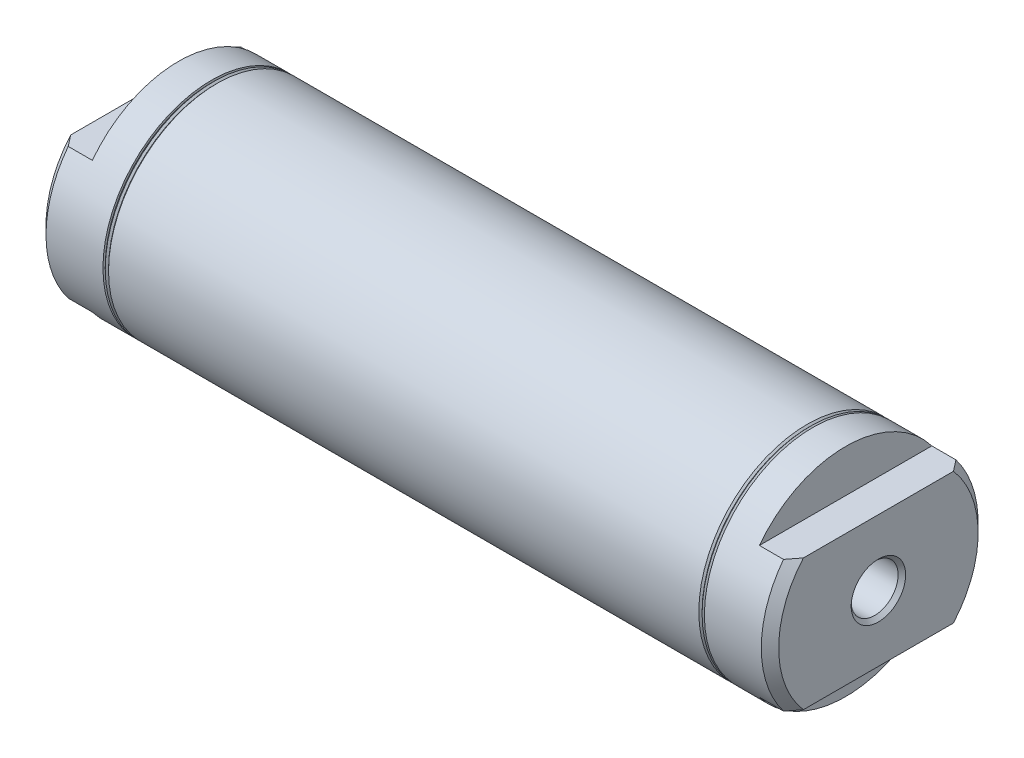
ISO-10303-21;
HEADER;
FILE_DESCRIPTION(('STEP AP214'),'2;1');
FILE_NAME('part.step','',(''),(''),'','','');
FILE_SCHEMA(('AUTOMOTIVE_DESIGN { 1 0 10303 214 1 1 1 1 }'));
ENDSEC;
DATA;
#1=APPLICATION_CONTEXT('core data for automotive mechanical design processes');
#2=APPLICATION_PROTOCOL_DEFINITION('international standard','automotive_design',2000,#1);
#3=PRODUCT_CONTEXT('',#1,'mechanical');
#4=PRODUCT('Part','Part','',(#3));
#5=PRODUCT_RELATED_PRODUCT_CATEGORY('part','',(#4));
#6=PRODUCT_DEFINITION_FORMATION('','',#4);
#7=PRODUCT_DEFINITION_CONTEXT('part definition',#1,'design');
#8=PRODUCT_DEFINITION('design','',#6,#7);
#9=PRODUCT_DEFINITION_SHAPE('','',#8);
#10=(LENGTH_UNIT() NAMED_UNIT(*) SI_UNIT(.MILLI.,.METRE.));
#11=(NAMED_UNIT(*) PLANE_ANGLE_UNIT() SI_UNIT($,.RADIAN.));
#12=(NAMED_UNIT(*) SI_UNIT($,.STERADIAN.) SOLID_ANGLE_UNIT());
#13=UNCERTAINTY_MEASURE_WITH_UNIT(LENGTH_MEASURE(1.E-05),#10,'distance_accuracy_value','');
#14=(GEOMETRIC_REPRESENTATION_CONTEXT(3) GLOBAL_UNCERTAINTY_ASSIGNED_CONTEXT((#13)) GLOBAL_UNIT_ASSIGNED_CONTEXT((#10,
#11,#12)) REPRESENTATION_CONTEXT('',''));
#15=CARTESIAN_POINT('',(0.,0.,0.));
#16=DIRECTION('',(0.,0.,1.));
#17=DIRECTION('',(1.,0.,0.));
#18=AXIS2_PLACEMENT_3D('',#15,#16,#17);
#19=CARTESIAN_POINT('',(176.9872,0.,0.));
#20=DIRECTION('',(-1.,0.,0.));
#21=DIRECTION('',(0.,0.,1.));
#22=AXIS2_PLACEMENT_3D('',#19,#20,#21);
#23=CYLINDRICAL_SURFACE('',#22,26.1874);
#24=DIRECTION('',(1.,0.,0.));
#25=VECTOR('',#24,1.);
#26=CARTESIAN_POINT('',(169.0624,15.875,-20.8270087569003));
#27=LINE('',#26,#25);
#28=CARTESIAN_POINT('',(169.0624,15.875,-20.8270087569003));
#29=VERTEX_POINT('',#28);
#30=CARTESIAN_POINT('',(174.892208,15.875,-20.8270087569003));
#31=VERTEX_POINT('',#30);
#32=EDGE_CURVE('E157',#29,#31,#27,.T.);
#33=ORIENTED_EDGE('',*,*,#32,.T.);
#34=CARTESIAN_POINT('',(174.892208,0.,0.));
#35=DIRECTION('',(1.,0.,0.));
#36=DIRECTION('',(0.,0.,-1.));
#37=AXIS2_PLACEMENT_3D('',#34,#35,#36);
#38=CIRCLE('',#37,26.1874);
#39=CARTESIAN_POINT('',(174.892208,-15.875,-20.8270087569003));
#40=VERTEX_POINT('',#39);
#41=EDGE_CURVE('E144',#31,#40,#38,.F.);
#42=ORIENTED_EDGE('',*,*,#41,.T.);
#43=DIRECTION('',(1.,0.,0.));
#44=VECTOR('',#43,1.);
#45=CARTESIAN_POINT('',(169.0624,-15.875,-20.8270087569003));
#46=LINE('',#45,#44);
#47=CARTESIAN_POINT('',(169.0624,-15.875,-20.8270087569003));
#48=VERTEX_POINT('',#47);
#49=EDGE_CURVE('E137',#48,#40,#46,.T.);
#50=ORIENTED_EDGE('',*,*,#49,.F.);
#51=CARTESIAN_POINT('',(169.0624,0.,0.));
#52=DIRECTION('',(1.,0.,0.));
#53=DIRECTION('',(0.,0.,-1.));
#54=AXIS2_PLACEMENT_3D('',#51,#52,#53);
#55=CIRCLE('',#54,26.1874);
#56=CARTESIAN_POINT('',(169.0624,-15.875,20.8270087569003));
#57=VERTEX_POINT('',#56);
#58=EDGE_CURVE('E125',#57,#48,#55,.T.);
#59=ORIENTED_EDGE('',*,*,#58,.F.);
#60=DIRECTION('',(1.,0.,0.));
#61=VECTOR('',#60,1.);
#62=CARTESIAN_POINT('',(169.0624,-15.875,20.8270087569003));
#63=LINE('',#62,#61);
#64=CARTESIAN_POINT('',(174.892208,-15.875,20.8270087569003));
#65=VERTEX_POINT('',#64);
#66=EDGE_CURVE('E138',#57,#65,#63,.T.);
#67=ORIENTED_EDGE('',*,*,#66,.T.);
#68=CARTESIAN_POINT('',(174.892208,0.,0.));
#69=DIRECTION('',(1.,0.,0.));
#70=DIRECTION('',(0.,0.,-1.));
#71=AXIS2_PLACEMENT_3D('',#68,#69,#70);
#72=CIRCLE('',#71,26.1874);
#73=CARTESIAN_POINT('',(174.892208,15.875,20.8270087569003));
#74=VERTEX_POINT('',#73);
#75=EDGE_CURVE('E309',#65,#74,#72,.F.);
#76=ORIENTED_EDGE('',*,*,#75,.T.);
#77=DIRECTION('',(1.,0.,0.));
#78=VECTOR('',#77,1.);
#79=CARTESIAN_POINT('',(169.0624,15.875,20.8270087569003));
#80=LINE('',#79,#78);
#81=CARTESIAN_POINT('',(169.0624,15.875,20.8270087569003));
#82=VERTEX_POINT('',#81);
#83=EDGE_CURVE('E155',#82,#74,#80,.T.);
#84=ORIENTED_EDGE('',*,*,#83,.F.);
#85=CARTESIAN_POINT('',(169.0624,0.,0.));
#86=DIRECTION('',(1.,0.,0.));
#87=DIRECTION('',(0.,0.,-1.));
#88=AXIS2_PLACEMENT_3D('',#85,#86,#87);
#89=CIRCLE('',#88,26.1874);
#90=EDGE_CURVE('E150',#29,#82,#89,.T.);
#91=ORIENTED_EDGE('',*,*,#90,.F.);
#92=EDGE_LOOP('',(#33,#42,#50,#59,#67,#76,#84,#91));
#93=FACE_BOUND('',#92,.T.);
#94=CARTESIAN_POINT('',(161.1376,0.,0.));
#95=DIRECTION('',(-1.,0.,0.));
#96=DIRECTION('',(0.,0.,1.));
#97=AXIS2_PLACEMENT_3D('',#94,#95,#96);
#98=CIRCLE('',#97,26.1874);
#99=CARTESIAN_POINT('',(161.1376,0.,26.1874));
#100=VERTEX_POINT('',#99);
#101=EDGE_CURVE('E184',#100,#100,#98,.T.);
#102=ORIENTED_EDGE('',*,*,#101,.F.);
#103=EDGE_LOOP('',(#102));
#104=FACE_BOUND('',#103,.T.);
#105=ADVANCED_FACE('F35',(#93,#104),#23,.T.);
#106=CARTESIAN_POINT('',(176.9872,26.1874,0.));
#107=DIRECTION('',(1.,0.,0.));
#108=DIRECTION('',(0.,0.,-1.));
#109=AXIS2_PLACEMENT_3D('',#106,#107,#108);
#110=PLANE('',#109);
#111=CARTESIAN_POINT('',(176.9872,0.,0.));
#112=DIRECTION('',(1.,0.,0.));
#113=DIRECTION('',(0.,0.,-1.));
#114=AXIS2_PLACEMENT_3D('',#111,#112,#113);
#115=CIRCLE('',#114,6.57849999999999);
#116=CARTESIAN_POINT('',(176.9872,0.,-6.57849999999997));
#117=VERTEX_POINT('',#116);
#118=EDGE_CURVE('E618',#117,#117,#115,.F.);
#119=ORIENTED_EDGE('',*,*,#118,.T.);
#120=EDGE_LOOP('',(#119));
#121=FACE_BOUND('',#120,.T.);
#122=DIRECTION('',(0.,0.,1.));
#123=VECTOR('',#122,1.);
#124=CARTESIAN_POINT('',(176.9872,-15.875,-20.8270087569003));
#125=LINE('',#124,#123);
#126=CARTESIAN_POINT('',(176.9872,-15.875,-18.122596343749));
#127=VERTEX_POINT('',#126);
#128=CARTESIAN_POINT('',(176.9872,-15.875,18.122596343749));
#129=VERTEX_POINT('',#128);
#130=EDGE_CURVE('E132',#127,#129,#125,.T.);
#131=ORIENTED_EDGE('',*,*,#130,.F.);
#132=CARTESIAN_POINT('',(176.9872,0.,0.));
#133=DIRECTION('',(1.,0.,0.));
#134=DIRECTION('',(0.,0.,-1.));
#135=AXIS2_PLACEMENT_3D('',#132,#133,#134);
#136=CIRCLE('',#135,24.092408);
#137=CARTESIAN_POINT('',(176.9872,15.875,-18.122596343749));
#138=VERTEX_POINT('',#137);
#139=EDGE_CURVE('E50',#127,#138,#136,.T.);
#140=ORIENTED_EDGE('',*,*,#139,.T.);
#141=DIRECTION('',(0.,0.,-1.));
#142=VECTOR('',#141,1.);
#143=CARTESIAN_POINT('',(176.9872,15.875,20.8270087569003));
#144=LINE('',#143,#142);
#145=CARTESIAN_POINT('',(176.9872,15.875,18.122596343749));
#146=VERTEX_POINT('',#145);
#147=EDGE_CURVE('E146',#146,#138,#144,.T.);
#148=ORIENTED_EDGE('',*,*,#147,.F.);
#149=CARTESIAN_POINT('',(176.9872,0.,0.));
#150=DIRECTION('',(1.,0.,0.));
#151=DIRECTION('',(0.,0.,-1.));
#152=AXIS2_PLACEMENT_3D('',#149,#150,#151);
#153=CIRCLE('',#152,24.092408);
#154=EDGE_CURVE('E361',#146,#129,#153,.T.);
#155=ORIENTED_EDGE('',*,*,#154,.T.);
#156=EDGE_LOOP('',(#131,#140,#148,#155));
#157=FACE_BOUND('',#156,.T.);
#158=ADVANCED_FACE('F290',(#121,#157),#110,.T.);
#159=CARTESIAN_POINT('',(0.,0.,0.));
#160=DIRECTION('',(-1.,0.,0.));
#161=DIRECTION('',(0.,0.,1.));
#162=AXIS2_PLACEMENT_3D('',#159,#160,#161);
#163=PLANE('',#162);
#164=CARTESIAN_POINT('',(0.,0.,0.));
#165=DIRECTION('',(-1.,0.,0.));
#166=DIRECTION('',(0.,0.,1.));
#167=AXIS2_PLACEMENT_3D('',#164,#165,#166);
#168=CIRCLE('',#167,6.57850000000002);
#169=CARTESIAN_POINT('',(0.,0.,6.57850000000002));
#170=VERTEX_POINT('',#169);
#171=EDGE_CURVE('E11',#170,#170,#168,.F.);
#172=ORIENTED_EDGE('',*,*,#171,.T.);
#173=EDGE_LOOP('',(#172));
#174=FACE_BOUND('',#173,.T.);
#175=DIRECTION('',(0.,0.,-1.));
#176=VECTOR('',#175,1.);
#177=CARTESIAN_POINT('',(0.,-15.875,20.8270087569003));
#178=LINE('',#177,#176);
#179=CARTESIAN_POINT('',(0.,-15.875,18.122596343749));
#180=VERTEX_POINT('',#179);
#181=CARTESIAN_POINT('',(0.,-15.875,-18.122596343749));
#182=VERTEX_POINT('',#181);
#183=EDGE_CURVE('E159',#180,#182,#178,.T.);
#184=ORIENTED_EDGE('',*,*,#183,.F.);
#185=CARTESIAN_POINT('',(0.,0.,0.));
#186=DIRECTION('',(-1.,0.,0.));
#187=DIRECTION('',(0.,0.,1.));
#188=AXIS2_PLACEMENT_3D('',#185,#186,#187);
#189=CIRCLE('',#188,24.092408);
#190=CARTESIAN_POINT('',(0.,15.875,18.122596343749));
#191=VERTEX_POINT('',#190);
#192=EDGE_CURVE('E219',#180,#191,#189,.T.);
#193=ORIENTED_EDGE('',*,*,#192,.T.);
#194=DIRECTION('',(0.,0.,1.));
#195=VECTOR('',#194,1.);
#196=CARTESIAN_POINT('',(0.,15.875,-20.8270087569003));
#197=LINE('',#196,#195);
#198=CARTESIAN_POINT('',(0.,15.875,-18.122596343749));
#199=VERTEX_POINT('',#198);
#200=EDGE_CURVE('E171',#199,#191,#197,.T.);
#201=ORIENTED_EDGE('',*,*,#200,.F.);
#202=CARTESIAN_POINT('',(0.,0.,0.));
#203=DIRECTION('',(-1.,0.,0.));
#204=DIRECTION('',(0.,0.,1.));
#205=AXIS2_PLACEMENT_3D('',#202,#203,#204);
#206=CIRCLE('',#205,24.092408);
#207=EDGE_CURVE('E216',#199,#182,#206,.T.);
#208=ORIENTED_EDGE('',*,*,#207,.T.);
#209=EDGE_LOOP('',(#184,#193,#201,#208));
#210=FACE_BOUND('',#209,.T.);
#211=ADVANCED_FACE('F286',(#174,#210),#163,.T.);
#212=CARTESIAN_POINT('',(176.9872,0.,0.));
#213=DIRECTION('',(-1.,0.,0.));
#214=DIRECTION('',(0.,0.,1.));
#215=AXIS2_PLACEMENT_3D('',#212,#213,#214);
#216=CYLINDRICAL_SURFACE('',#215,26.1874);
#217=DIRECTION('',(-1.,0.,0.));
#218=VECTOR('',#217,1.);
#219=CARTESIAN_POINT('',(7.9248,15.875,20.8270087569003));
#220=LINE('',#219,#218);
#221=CARTESIAN_POINT('',(7.92480000000001,15.875,20.8270087569003));
#222=VERTEX_POINT('',#221);
#223=CARTESIAN_POINT('',(2.09499200000002,15.875,20.8270087569003));
#224=VERTEX_POINT('',#223);
#225=EDGE_CURVE('E181',#222,#224,#220,.T.);
#226=ORIENTED_EDGE('',*,*,#225,.T.);
#227=CARTESIAN_POINT('',(2.09499200000002,0.,0.));
#228=DIRECTION('',(-1.,0.,0.));
#229=DIRECTION('',(0.,0.,1.));
#230=AXIS2_PLACEMENT_3D('',#227,#228,#229);
#231=CIRCLE('',#230,26.1874);
#232=CARTESIAN_POINT('',(2.09499200000002,-15.875,20.8270087569003));
#233=VERTEX_POINT('',#232);
#234=EDGE_CURVE('E560',#224,#233,#231,.F.);
#235=ORIENTED_EDGE('',*,*,#234,.T.);
#236=DIRECTION('',(-1.,0.,0.));
#237=VECTOR('',#236,1.);
#238=CARTESIAN_POINT('',(7.9248,-15.875,20.8270087569003));
#239=LINE('',#238,#237);
#240=CARTESIAN_POINT('',(7.9248,-15.875,20.8270087569003));
#241=VERTEX_POINT('',#240);
#242=EDGE_CURVE('E165',#241,#233,#239,.T.);
#243=ORIENTED_EDGE('',*,*,#242,.F.);
#244=CARTESIAN_POINT('',(7.9248,0.,0.));
#245=DIRECTION('',(-1.,0.,0.));
#246=DIRECTION('',(0.,0.,1.));
#247=AXIS2_PLACEMENT_3D('',#244,#245,#246);
#248=CIRCLE('',#247,26.1874);
#249=CARTESIAN_POINT('',(7.92480000000001,-15.875,-20.8270087569003));
#250=VERTEX_POINT('',#249);
#251=EDGE_CURVE('E161',#250,#241,#248,.T.);
#252=ORIENTED_EDGE('',*,*,#251,.F.);
#253=DIRECTION('',(-1.,0.,0.));
#254=VECTOR('',#253,1.);
#255=CARTESIAN_POINT('',(7.9248,-15.875,-20.8270087569003));
#256=LINE('',#255,#254);
#257=CARTESIAN_POINT('',(2.09499200000002,-15.875,-20.8270087569003));
#258=VERTEX_POINT('',#257);
#259=EDGE_CURVE('E168',#250,#258,#256,.T.);
#260=ORIENTED_EDGE('',*,*,#259,.T.);
#261=CARTESIAN_POINT('',(2.09499200000002,0.,0.));
#262=DIRECTION('',(-1.,0.,0.));
#263=DIRECTION('',(0.,0.,1.));
#264=AXIS2_PLACEMENT_3D('',#261,#262,#263);
#265=CIRCLE('',#264,26.1874);
#266=CARTESIAN_POINT('',(2.09499200000002,15.875,-20.8270087569003));
#267=VERTEX_POINT('',#266);
#268=EDGE_CURVE('E556',#258,#267,#265,.F.);
#269=ORIENTED_EDGE('',*,*,#268,.T.);
#270=DIRECTION('',(-1.,0.,0.));
#271=VECTOR('',#270,1.);
#272=CARTESIAN_POINT('',(7.9248,15.875,-20.8270087569003));
#273=LINE('',#272,#271);
#274=CARTESIAN_POINT('',(7.9248,15.875,-20.8270087569003));
#275=VERTEX_POINT('',#274);
#276=EDGE_CURVE('E178',#275,#267,#273,.T.);
#277=ORIENTED_EDGE('',*,*,#276,.F.);
#278=CARTESIAN_POINT('',(7.9248,0.,0.));
#279=DIRECTION('',(-1.,0.,0.));
#280=DIRECTION('',(0.,0.,1.));
#281=AXIS2_PLACEMENT_3D('',#278,#279,#280);
#282=CIRCLE('',#281,26.1874);
#283=EDGE_CURVE('E174',#222,#275,#282,.T.);
#284=ORIENTED_EDGE('',*,*,#283,.F.);
#285=EDGE_LOOP('',(#226,#235,#243,#252,#260,#269,#277,#284));
#286=FACE_BOUND('',#285,.T.);
#287=CARTESIAN_POINT('',(15.8496,0.,0.));
#288=DIRECTION('',(-1.,0.,0.));
#289=DIRECTION('',(0.,0.,1.));
#290=AXIS2_PLACEMENT_3D('',#287,#288,#289);
#291=CIRCLE('',#290,26.1874);
#292=CARTESIAN_POINT('',(15.8496,0.,26.1874));
#293=VERTEX_POINT('',#292);
#294=EDGE_CURVE('E213',#293,#293,#291,.T.);
#295=ORIENTED_EDGE('',*,*,#294,.T.);
#296=EDGE_LOOP('',(#295));
#297=FACE_BOUND('',#296,.T.);
#298=ADVANCED_FACE('F282',(#286,#297),#216,.T.);
#299=CARTESIAN_POINT('',(15.8496,26.1874,0.));
#300=DIRECTION('',(1.,0.,0.));
#301=DIRECTION('',(0.,0.,-1.));
#302=AXIS2_PLACEMENT_3D('',#299,#300,#301);
#303=PLANE('',#302);
#304=CARTESIAN_POINT('',(15.8496,0.,0.));
#305=DIRECTION('',(-1.,0.,0.));
#306=DIRECTION('',(0.,0.,1.));
#307=AXIS2_PLACEMENT_3D('',#304,#305,#306);
#308=CIRCLE('',#307,25.632664);
#309=CARTESIAN_POINT('',(15.8496,0.,25.632664));
#310=VERTEX_POINT('',#309);
#311=EDGE_CURVE('E210',#310,#310,#308,.T.);
#312=ORIENTED_EDGE('',*,*,#311,.T.);
#313=EDGE_LOOP('',(#312));
#314=FACE_BOUND('',#313,.T.);
#315=ORIENTED_EDGE('',*,*,#294,.F.);
#316=EDGE_LOOP('',(#315));
#317=FACE_BOUND('',#316,.T.);
#318=ADVANCED_FACE('F278',(#314,#317),#303,.T.);
#319=CARTESIAN_POINT('',(15.8496,0.,0.));
#320=DIRECTION('',(1.,0.,0.));
#321=DIRECTION('',(0.,0.,-1.));
#322=AXIS2_PLACEMENT_3D('',#319,#320,#321);
#323=CONICAL_SURFACE('',#322,25.632664,0.785398163397448);
#324=CARTESIAN_POINT('',(16.404336,0.,0.));
#325=DIRECTION('',(-1.,0.,0.));
#326=DIRECTION('',(0.,0.,1.));
#327=AXIS2_PLACEMENT_3D('',#324,#325,#326);
#328=CIRCLE('',#327,26.1874);
#329=CARTESIAN_POINT('',(16.404336,0.,26.1874));
#330=VERTEX_POINT('',#329);
#331=EDGE_CURVE('E207',#330,#330,#328,.T.);
#332=ORIENTED_EDGE('',*,*,#331,.T.);
#333=EDGE_LOOP('',(#332));
#334=FACE_BOUND('',#333,.T.);
#335=ORIENTED_EDGE('',*,*,#311,.F.);
#336=EDGE_LOOP('',(#335));
#337=FACE_BOUND('',#336,.T.);
#338=ADVANCED_FACE('F274',(#334,#337),#323,.T.);
#339=CARTESIAN_POINT('',(16.404336,0.,0.));
#340=DIRECTION('',(-1.,0.,0.));
#341=DIRECTION('',(0.,0.,1.));
#342=AXIS2_PLACEMENT_3D('',#339,#340,#341);
#343=CONICAL_SURFACE('',#342,26.1874,0.785398163397475);
#344=CARTESIAN_POINT('',(16.800576,0.,0.));
#345=DIRECTION('',(-1.,0.,0.));
#346=DIRECTION('',(0.,0.,1.));
#347=AXIS2_PLACEMENT_3D('',#344,#345,#346);
#348=CIRCLE('',#347,25.79116);
#349=CARTESIAN_POINT('',(16.800576,0.,25.79116));
#350=VERTEX_POINT('',#349);
#351=EDGE_CURVE('E204',#350,#350,#348,.T.);
#352=ORIENTED_EDGE('',*,*,#351,.T.);
#353=EDGE_LOOP('',(#352));
#354=FACE_BOUND('',#353,.T.);
#355=ORIENTED_EDGE('',*,*,#331,.F.);
#356=EDGE_LOOP('',(#355));
#357=FACE_BOUND('',#356,.T.);
#358=ADVANCED_FACE('F270',(#354,#357),#343,.T.);
#359=CARTESIAN_POINT('',(16.800576,0.,0.));
#360=DIRECTION('',(1.,0.,0.));
#361=DIRECTION('',(0.,0.,-1.));
#362=AXIS2_PLACEMENT_3D('',#359,#360,#361);
#363=CONICAL_SURFACE('',#362,25.79116,0.785398163397461);
#364=CARTESIAN_POINT('',(17.196816,0.,0.));
#365=DIRECTION('',(-1.,0.,0.));
#366=DIRECTION('',(0.,0.,1.));
#367=AXIS2_PLACEMENT_3D('',#364,#365,#366);
#368=CIRCLE('',#367,26.1874);
#369=CARTESIAN_POINT('',(17.196816,0.,26.1874));
#370=VERTEX_POINT('',#369);
#371=EDGE_CURVE('E201',#370,#370,#368,.T.);
#372=ORIENTED_EDGE('',*,*,#371,.T.);
#373=EDGE_LOOP('',(#372));
#374=FACE_BOUND('',#373,.T.);
#375=ORIENTED_EDGE('',*,*,#351,.F.);
#376=EDGE_LOOP('',(#375));
#377=FACE_BOUND('',#376,.T.);
#378=ADVANCED_FACE('F266',(#374,#377),#363,.T.);
#379=CARTESIAN_POINT('',(176.9872,0.,0.));
#380=DIRECTION('',(-1.,0.,0.));
#381=DIRECTION('',(0.,0.,1.));
#382=AXIS2_PLACEMENT_3D('',#379,#380,#381);
#383=CYLINDRICAL_SURFACE('',#382,26.1874);
#384=CARTESIAN_POINT('',(159.790384,0.,0.));
#385=DIRECTION('',(-1.,0.,0.));
#386=DIRECTION('',(0.,0.,1.));
#387=AXIS2_PLACEMENT_3D('',#384,#385,#386);
#388=CIRCLE('',#387,26.1874);
#389=CARTESIAN_POINT('',(159.790384,0.,26.1874));
#390=VERTEX_POINT('',#389);
#391=EDGE_CURVE('E198',#390,#390,#388,.T.);
#392=ORIENTED_EDGE('',*,*,#391,.T.);
#393=EDGE_LOOP('',(#392));
#394=FACE_BOUND('',#393,.T.);
#395=ORIENTED_EDGE('',*,*,#371,.F.);
#396=EDGE_LOOP('',(#395));
#397=FACE_BOUND('',#396,.T.);
#398=ADVANCED_FACE('F262',(#394,#397),#383,.T.);
#399=CARTESIAN_POINT('',(159.790384,0.,0.));
#400=DIRECTION('',(-1.,0.,0.));
#401=DIRECTION('',(0.,0.,1.));
#402=AXIS2_PLACEMENT_3D('',#399,#400,#401);
#403=CONICAL_SURFACE('',#402,26.1874,0.785398163397439);
#404=CARTESIAN_POINT('',(160.186624,0.,0.));
#405=DIRECTION('',(-1.,0.,0.));
#406=DIRECTION('',(0.,0.,1.));
#407=AXIS2_PLACEMENT_3D('',#404,#405,#406);
#408=CIRCLE('',#407,25.79116);
#409=CARTESIAN_POINT('',(160.186624,0.,25.79116));
#410=VERTEX_POINT('',#409);
#411=EDGE_CURVE('E195',#410,#410,#408,.T.);
#412=ORIENTED_EDGE('',*,*,#411,.T.);
#413=EDGE_LOOP('',(#412));
#414=FACE_BOUND('',#413,.T.);
#415=ORIENTED_EDGE('',*,*,#391,.F.);
#416=EDGE_LOOP('',(#415));
#417=FACE_BOUND('',#416,.T.);
#418=ADVANCED_FACE('F258',(#414,#417),#403,.T.);
#419=CARTESIAN_POINT('',(160.186624,0.,0.));
#420=DIRECTION('',(1.,0.,0.));
#421=DIRECTION('',(0.,0.,-1.));
#422=AXIS2_PLACEMENT_3D('',#419,#420,#421);
#423=CONICAL_SURFACE('',#422,25.79116,0.785398163397396);
#424=CARTESIAN_POINT('',(160.582864,0.,0.));
#425=DIRECTION('',(-1.,0.,0.));
#426=DIRECTION('',(0.,0.,1.));
#427=AXIS2_PLACEMENT_3D('',#424,#425,#426);
#428=CIRCLE('',#427,26.1874);
#429=CARTESIAN_POINT('',(160.582864,0.,26.1874));
#430=VERTEX_POINT('',#429);
#431=EDGE_CURVE('E192',#430,#430,#428,.T.);
#432=ORIENTED_EDGE('',*,*,#431,.T.);
#433=EDGE_LOOP('',(#432));
#434=FACE_BOUND('',#433,.T.);
#435=ORIENTED_EDGE('',*,*,#411,.F.);
#436=EDGE_LOOP('',(#435));
#437=FACE_BOUND('',#436,.T.);
#438=ADVANCED_FACE('F254',(#434,#437),#423,.T.);
#439=CARTESIAN_POINT('',(160.582864,0.,0.));
#440=DIRECTION('',(-1.,0.,0.));
#441=DIRECTION('',(0.,0.,1.));
#442=AXIS2_PLACEMENT_3D('',#439,#440,#441);
#443=CONICAL_SURFACE('',#442,26.1874,0.785398163397436);
#444=CARTESIAN_POINT('',(161.1376,0.,0.));
#445=DIRECTION('',(-1.,0.,0.));
#446=DIRECTION('',(0.,0.,1.));
#447=AXIS2_PLACEMENT_3D('',#444,#445,#446);
#448=CIRCLE('',#447,25.632664);
#449=CARTESIAN_POINT('',(161.1376,0.,25.632664));
#450=VERTEX_POINT('',#449);
#451=EDGE_CURVE('E189',#450,#450,#448,.T.);
#452=ORIENTED_EDGE('',*,*,#451,.T.);
#453=EDGE_LOOP('',(#452));
#454=FACE_BOUND('',#453,.T.);
#455=ORIENTED_EDGE('',*,*,#431,.F.);
#456=EDGE_LOOP('',(#455));
#457=FACE_BOUND('',#456,.T.);
#458=ADVANCED_FACE('F250',(#454,#457),#443,.T.);
#459=CARTESIAN_POINT('',(161.1376,25.632664,0.));
#460=DIRECTION('',(-1.,0.,0.));
#461=DIRECTION('',(0.,0.,1.));
#462=AXIS2_PLACEMENT_3D('',#459,#460,#461);
#463=PLANE('',#462);
#464=ORIENTED_EDGE('',*,*,#101,.T.);
#465=EDGE_LOOP('',(#464));
#466=FACE_BOUND('',#465,.T.);
#467=ORIENTED_EDGE('',*,*,#451,.F.);
#468=EDGE_LOOP('',(#467));
#469=FACE_BOUND('',#468,.T.);
#470=ADVANCED_FACE('F244',(#466,#469),#463,.T.);
#471=CARTESIAN_POINT('',(7.9248,15.875,-20.8270087569003));
#472=DIRECTION('',(0.,-1.,0.));
#473=DIRECTION('',(0.,0.,-1.));
#474=AXIS2_PLACEMENT_3D('',#471,#472,#473);
#475=PLANE('',#474);
#476=ORIENTED_EDGE('',*,*,#200,.T.);
#477=CARTESIAN_POINT('',(0.,15.875,18.122596343749));
#478=CARTESIAN_POINT('',(0.171381692511651,15.875,18.3504285411159));
#479=CARTESIAN_POINT('',(0.343654117806424,15.875,18.5775891206213));
#480=CARTESIAN_POINT('',(0.689835989970988,15.875,19.0306434375234));
#481=CARTESIAN_POINT('',(0.863745362446376,15.875,19.2565372317542));
#482=CARTESIAN_POINT('',(1.21307124662204,15.875,19.7071537192967));
#483=CARTESIAN_POINT('',(1.38848774998017,15.875,19.9318764190794));
#484=CARTESIAN_POINT('',(1.7407207726971,15.875,20.3802385432839));
#485=CARTESIAN_POINT('',(1.91753735500781,15.875,20.6038779182589));
#486=CARTESIAN_POINT('',(2.09499199999998,15.875,20.8270087569003));
#487=B_SPLINE_CURVE_WITH_KNOTS('',3,(#477,#478,#479,#480,#481,#482,#483,#484,#485,#486),
.UNSPECIFIED.,.F.,.F.,(4,2,2,2,4),(0.,0.855281182686254,1.71052368126857,2.5657614490328,
3.42103789181922),.UNSPECIFIED.);
#488=EDGE_CURVE('E229',#191,#224,#487,.T.);
#489=ORIENTED_EDGE('',*,*,#488,.T.);
#490=ORIENTED_EDGE('',*,*,#225,.F.);
#491=DIRECTION('',(0.,0.,1.));
#492=VECTOR('',#491,1.);
#493=CARTESIAN_POINT('',(7.9248,15.875,-20.8270087569003));
#494=LINE('',#493,#492);
#495=EDGE_CURVE('E176',#275,#222,#494,.T.);
#496=ORIENTED_EDGE('',*,*,#495,.F.);
#497=ORIENTED_EDGE('',*,*,#276,.T.);
#498=CARTESIAN_POINT('',(2.09499200000002,15.875,-20.8270087569003));
#499=CARTESIAN_POINT('',(1.91753735500782,15.875,-20.6038779182589));
#500=CARTESIAN_POINT('',(1.7407207726971,15.875,-20.3802385432839));
#501=CARTESIAN_POINT('',(1.38848774998017,15.875,-19.9318764190794));
#502=CARTESIAN_POINT('',(1.21307124662204,15.875,-19.7071537192967));
#503=CARTESIAN_POINT('',(0.863745362446378,15.875,-19.2565372317542));
#504=CARTESIAN_POINT('',(0.689835989970988,15.875,-19.0306434375234));
#505=CARTESIAN_POINT('',(0.343654117806422,15.875,-18.5775891206213));
#506=CARTESIAN_POINT('',(0.17138169251165,15.875,-18.3504285411159));
#507=CARTESIAN_POINT('',(0.,15.875,-18.122596343749));
#508=B_SPLINE_CURVE_WITH_KNOTS('',3,(#498,#499,#500,#501,#502,#503,#504,#505,#506,#507),
.UNSPECIFIED.,.F.,.F.,(4,2,2,2,4),(0.,0.855276442786417,1.71051421055065,2.56575670913298,
3.42103789181923),.UNSPECIFIED.);
#509=EDGE_CURVE('E222',#267,#199,#508,.T.);
#510=ORIENTED_EDGE('',*,*,#509,.T.);
#511=EDGE_LOOP('',(#476,#489,#490,#496,#497,#510));
#512=FACE_BOUND('',#511,.T.);
#513=ADVANCED_FACE('F238',(#512),#475,.F.);
#514=CARTESIAN_POINT('',(7.9248,0.,0.));
#515=DIRECTION('',(-1.,0.,0.));
#516=DIRECTION('',(0.,0.,1.));
#517=AXIS2_PLACEMENT_3D('',#514,#515,#516);
#518=PLANE('',#517);
#519=ORIENTED_EDGE('',*,*,#283,.T.);
#520=ORIENTED_EDGE('',*,*,#495,.T.);
#521=EDGE_LOOP('',(#519,#520));
#522=FACE_BOUND('',#521,.T.);
#523=ADVANCED_FACE('F243',(#522),#518,.T.);
#524=CARTESIAN_POINT('',(7.9248,-15.875,20.8270087569003));
#525=DIRECTION('',(0.,1.,0.));
#526=DIRECTION('',(0.,0.,1.));
#527=AXIS2_PLACEMENT_3D('',#524,#525,#526);
#528=PLANE('',#527);
#529=ORIENTED_EDGE('',*,*,#242,.T.);
#530=CARTESIAN_POINT('',(2.09499200000002,-15.875,20.8270087569003));
#531=CARTESIAN_POINT('',(1.91753735500782,-15.875,20.6038779182589));
#532=CARTESIAN_POINT('',(1.7407207726971,-15.875,20.3802385432839));
#533=CARTESIAN_POINT('',(1.38848774998017,-15.875,19.9318764190794));
#534=CARTESIAN_POINT('',(1.21307124662204,-15.875,19.7071537192967));
#535=CARTESIAN_POINT('',(0.863745362446378,-15.875,19.2565372317542));
#536=CARTESIAN_POINT('',(0.689835989970988,-15.875,19.0306434375234));
#537=CARTESIAN_POINT('',(0.343654117806422,-15.875,18.5775891206213));
#538=CARTESIAN_POINT('',(0.17138169251165,-15.875,18.3504285411159));
#539=CARTESIAN_POINT('',(0.,-15.875,18.122596343749));
#540=B_SPLINE_CURVE_WITH_KNOTS('',3,(#530,#531,#532,#533,#534,#535,#536,#537,#538,#539),
.UNSPECIFIED.,.F.,.F.,(4,2,2,2,4),(0.,0.855276442786417,1.71051421055065,2.56575670913298,
3.42103789181923),.UNSPECIFIED.);
#541=EDGE_CURVE('E303',#233,#180,#540,.T.);
#542=ORIENTED_EDGE('',*,*,#541,.T.);
#543=ORIENTED_EDGE('',*,*,#183,.T.);
#544=CARTESIAN_POINT('',(0.,-15.875,-18.122596343749));
#545=CARTESIAN_POINT('',(0.171381692511651,-15.875,-18.3504285411159));
#546=CARTESIAN_POINT('',(0.343654117806424,-15.875,-18.5775891206213));
#547=CARTESIAN_POINT('',(0.689835989970988,-15.875,-19.0306434375234));
#548=CARTESIAN_POINT('',(0.863745362446376,-15.875,-19.2565372317542));
#549=CARTESIAN_POINT('',(1.21307124662204,-15.875,-19.7071537192967));
#550=CARTESIAN_POINT('',(1.38848774998017,-15.875,-19.9318764190794));
#551=CARTESIAN_POINT('',(1.7407207726971,-15.875,-20.3802385432839));
#552=CARTESIAN_POINT('',(1.91753735500781,-15.875,-20.6038779182589));
#553=CARTESIAN_POINT('',(2.09499199999998,-15.875,-20.8270087569003));
#554=B_SPLINE_CURVE_WITH_KNOTS('',3,(#544,#545,#546,#547,#548,#549,#550,#551,#552,#553),
.UNSPECIFIED.,.F.,.F.,(4,2,2,2,4),(0.,0.855281182686254,1.71052368126857,2.5657614490328,
3.42103789181922),.UNSPECIFIED.);
#555=EDGE_CURVE('E310',#182,#258,#554,.T.);
#556=ORIENTED_EDGE('',*,*,#555,.T.);
#557=ORIENTED_EDGE('',*,*,#259,.F.);
#558=DIRECTION('',(0.,0.,-1.));
#559=VECTOR('',#558,1.);
#560=CARTESIAN_POINT('',(7.9248,-15.875,20.8270087569003));
#561=LINE('',#560,#559);
#562=EDGE_CURVE('E163',#241,#250,#561,.T.);
#563=ORIENTED_EDGE('',*,*,#562,.F.);
#564=EDGE_LOOP('',(#529,#542,#543,#556,#557,#563));
#565=FACE_BOUND('',#564,.T.);
#566=ADVANCED_FACE('F316',(#565),#528,.F.);
#567=CARTESIAN_POINT('',(7.9248,0.,0.));
#568=DIRECTION('',(-1.,0.,0.));
#569=DIRECTION('',(0.,0.,1.));
#570=AXIS2_PLACEMENT_3D('',#567,#568,#569);
#571=PLANE('',#570);
#572=ORIENTED_EDGE('',*,*,#251,.T.);
#573=ORIENTED_EDGE('',*,*,#562,.T.);
#574=EDGE_LOOP('',(#572,#573));
#575=FACE_BOUND('',#574,.T.);
#576=ADVANCED_FACE('F320',(#575),#571,.T.);
#577=CARTESIAN_POINT('',(169.0624,15.875,20.8270087569003));
#578=DIRECTION('',(0.,-1.,0.));
#579=DIRECTION('',(0.,0.,-1.));
#580=AXIS2_PLACEMENT_3D('',#577,#578,#579);
#581=PLANE('',#580);
#582=ORIENTED_EDGE('',*,*,#147,.T.);
#583=CARTESIAN_POINT('',(176.9872,15.875,-18.122596343749));
#584=CARTESIAN_POINT('',(176.815818307488,15.875,-18.3504285411158));
#585=CARTESIAN_POINT('',(176.643545882194,15.875,-18.5775891206213));
#586=CARTESIAN_POINT('',(176.297364010029,15.875,-19.0306434375234));
#587=CARTESIAN_POINT('',(176.123454637554,15.875,-19.2565372317542));
#588=CARTESIAN_POINT('',(175.774128753378,15.875,-19.7071537192967));
#589=CARTESIAN_POINT('',(175.59871225002,15.875,-19.9318764190794));
#590=CARTESIAN_POINT('',(175.246479227303,15.875,-20.3802385432839));
#591=CARTESIAN_POINT('',(175.069662644992,15.875,-20.6038779182589));
#592=CARTESIAN_POINT('',(174.892208,15.875,-20.8270087569003));
#593=B_SPLINE_CURVE_WITH_KNOTS('',3,(#583,#584,#585,#586,#587,#588,#589,#590,#591,#592),
.UNSPECIFIED.,.F.,.F.,(4,2,2,2,4),(0.,0.855281182686237,1.71052368126856,2.56576144903281,
3.42103789181924),.UNSPECIFIED.);
#594=EDGE_CURVE('E340',#138,#31,#593,.T.);
#595=ORIENTED_EDGE('',*,*,#594,.T.);
#596=ORIENTED_EDGE('',*,*,#32,.F.);
#597=DIRECTION('',(0.,0.,-1.));
#598=VECTOR('',#597,1.);
#599=CARTESIAN_POINT('',(169.0624,15.875,20.8270087569003));
#600=LINE('',#599,#598);
#601=EDGE_CURVE('E152',#82,#29,#600,.T.);
#602=ORIENTED_EDGE('',*,*,#601,.F.);
#603=ORIENTED_EDGE('',*,*,#83,.T.);
#604=CARTESIAN_POINT('',(174.892208,15.875,20.8270087569003));
#605=CARTESIAN_POINT('',(175.069662644992,15.875,20.6038779182589));
#606=CARTESIAN_POINT('',(175.246479227303,15.875,20.3802385432839));
#607=CARTESIAN_POINT('',(175.59871225002,15.875,19.9318764190794));
#608=CARTESIAN_POINT('',(175.774128753378,15.875,19.7071537192967));
#609=CARTESIAN_POINT('',(176.123454637554,15.875,19.2565372317542));
#610=CARTESIAN_POINT('',(176.297364010029,15.875,19.0306434375234));
#611=CARTESIAN_POINT('',(176.643545882194,15.875,18.5775891206213));
#612=CARTESIAN_POINT('',(176.815818307488,15.875,18.3504285411159));
#613=CARTESIAN_POINT('',(176.9872,15.875,18.122596343749));
#614=B_SPLINE_CURVE_WITH_KNOTS('',3,(#604,#605,#606,#607,#608,#609,#610,#611,#612,#613),
.UNSPECIFIED.,.F.,.F.,(4,2,2,2,4),(0.,0.855276442786427,1.71051421055066,2.56575670913298,
3.42103789181922),.UNSPECIFIED.);
#615=EDGE_CURVE('E57',#74,#146,#614,.T.);
#616=ORIENTED_EDGE('',*,*,#615,.T.);
#617=EDGE_LOOP('',(#582,#595,#596,#602,#603,#616));
#618=FACE_BOUND('',#617,.T.);
#619=ADVANCED_FACE('F325',(#618),#581,.F.);
#620=CARTESIAN_POINT('',(169.0624,0.,0.));
#621=DIRECTION('',(1.,0.,0.));
#622=DIRECTION('',(0.,0.,-1.));
#623=AXIS2_PLACEMENT_3D('',#620,#621,#622);
#624=PLANE('',#623);
#625=ORIENTED_EDGE('',*,*,#90,.T.);
#626=ORIENTED_EDGE('',*,*,#601,.T.);
#627=EDGE_LOOP('',(#625,#626));
#628=FACE_BOUND('',#627,.T.);
#629=ADVANCED_FACE('F330',(#628),#624,.T.);
#630=CARTESIAN_POINT('',(169.0624,-15.875,-20.8270087569003));
#631=DIRECTION('',(0.,1.,0.));
#632=DIRECTION('',(0.,0.,1.));
#633=AXIS2_PLACEMENT_3D('',#630,#631,#632);
#634=PLANE('',#633);
#635=ORIENTED_EDGE('',*,*,#49,.T.);
#636=CARTESIAN_POINT('',(174.892208,-15.875,-20.8270087569003));
#637=CARTESIAN_POINT('',(175.069662644992,-15.875,-20.6038779182589));
#638=CARTESIAN_POINT('',(175.246479227303,-15.875,-20.3802385432839));
#639=CARTESIAN_POINT('',(175.59871225002,-15.875,-19.9318764190794));
#640=CARTESIAN_POINT('',(175.774128753378,-15.875,-19.7071537192967));
#641=CARTESIAN_POINT('',(176.123454637554,-15.875,-19.2565372317542));
#642=CARTESIAN_POINT('',(176.297364010029,-15.875,-19.0306434375234));
#643=CARTESIAN_POINT('',(176.643545882194,-15.875,-18.5775891206213));
#644=CARTESIAN_POINT('',(176.815818307488,-15.875,-18.3504285411159));
#645=CARTESIAN_POINT('',(176.9872,-15.875,-18.122596343749));
#646=B_SPLINE_CURVE_WITH_KNOTS('',3,(#636,#637,#638,#639,#640,#641,#642,#643,#644,#645),
.UNSPECIFIED.,.F.,.F.,(4,2,2,2,4),(0.,0.855276442786427,1.71051421055066,2.56575670913298,
3.42103789181922),.UNSPECIFIED.);
#647=EDGE_CURVE('E355',#40,#127,#646,.T.);
#648=ORIENTED_EDGE('',*,*,#647,.T.);
#649=ORIENTED_EDGE('',*,*,#130,.T.);
#650=CARTESIAN_POINT('',(176.9872,-15.875,18.122596343749));
#651=CARTESIAN_POINT('',(176.815818307488,-15.875,18.3504285411158));
#652=CARTESIAN_POINT('',(176.643545882194,-15.875,18.5775891206213));
#653=CARTESIAN_POINT('',(176.297364010029,-15.875,19.0306434375234));
#654=CARTESIAN_POINT('',(176.123454637554,-15.875,19.2565372317542));
#655=CARTESIAN_POINT('',(175.774128753378,-15.875,19.7071537192967));
#656=CARTESIAN_POINT('',(175.59871225002,-15.875,19.9318764190794));
#657=CARTESIAN_POINT('',(175.246479227303,-15.875,20.3802385432839));
#658=CARTESIAN_POINT('',(175.069662644992,-15.875,20.6038779182589));
#659=CARTESIAN_POINT('',(174.892208,-15.875,20.8270087569003));
#660=B_SPLINE_CURVE_WITH_KNOTS('',3,(#650,#651,#652,#653,#654,#655,#656,#657,#658,#659),
.UNSPECIFIED.,.F.,.F.,(4,2,2,2,4),(0.,0.855281182686237,1.71052368126856,2.56576144903281,
3.42103789181924),.UNSPECIFIED.);
#661=EDGE_CURVE('E362',#129,#65,#660,.T.);
#662=ORIENTED_EDGE('',*,*,#661,.T.);
#663=ORIENTED_EDGE('',*,*,#66,.F.);
#664=DIRECTION('',(0.,0.,1.));
#665=VECTOR('',#664,1.);
#666=CARTESIAN_POINT('',(169.0624,-15.875,-20.8270087569003));
#667=LINE('',#666,#665);
#668=EDGE_CURVE('E128',#48,#57,#667,.T.);
#669=ORIENTED_EDGE('',*,*,#668,.F.);
#670=EDGE_LOOP('',(#635,#648,#649,#662,#663,#669));
#671=FACE_BOUND('',#670,.T.);
#672=ADVANCED_FACE('F136',(#671),#634,.F.);
#673=CARTESIAN_POINT('',(169.0624,0.,0.));
#674=DIRECTION('',(1.,0.,0.));
#675=DIRECTION('',(0.,0.,-1.));
#676=AXIS2_PLACEMENT_3D('',#673,#674,#675);
#677=PLANE('',#676);
#678=ORIENTED_EDGE('',*,*,#58,.T.);
#679=ORIENTED_EDGE('',*,*,#668,.T.);
#680=EDGE_LOOP('',(#678,#679));
#681=FACE_BOUND('',#680,.T.);
#682=ADVANCED_FACE('F127',(#681),#677,.T.);
#683=CARTESIAN_POINT('',(167.47744,0.,0.));
#684=DIRECTION('',(-1.,0.,0.));
#685=DIRECTION('',(0.,0.,1.));
#686=AXIS2_PLACEMENT_3D('',#683,#684,#685);
#687=PLANE('',#686);
#688=CARTESIAN_POINT('',(167.47744,0.,0.));
#689=DIRECTION('',(1.,0.,0.));
#690=DIRECTION('',(0.,0.,-1.));
#691=AXIS2_PLACEMENT_3D('',#688,#689,#690);
#692=CIRCLE('',#691,5.67499999999999);
#693=CARTESIAN_POINT('',(167.47744,0.,-5.67499999999999));
#694=VERTEX_POINT('',#693);
#695=EDGE_CURVE('E394',#694,#694,#692,.T.);
#696=ORIENTED_EDGE('',*,*,#695,.T.);
#697=EDGE_LOOP('',(#696));
#698=FACE_BOUND('',#697,.T.);
#699=ADVANCED_FACE('F372',(#698),#687,.F.);
#700=CARTESIAN_POINT('',(176.9872,0.,0.));
#701=DIRECTION('',(1.,0.,0.));
#702=DIRECTION('',(0.,0.,-1.));
#703=AXIS2_PLACEMENT_3D('',#700,#701,#702);
#704=CYLINDRICAL_SURFACE('',#703,5.67499999999999);
#705=CARTESIAN_POINT('',(176.0837,0.,0.));
#706=DIRECTION('',(1.,0.,0.));
#707=DIRECTION('',(0.,0.,-1.));
#708=AXIS2_PLACEMENT_3D('',#705,#706,#707);
#709=CIRCLE('',#708,5.67499999999999);
#710=CARTESIAN_POINT('',(176.0837,0.,-5.67499999999997));
#711=VERTEX_POINT('',#710);
#712=EDGE_CURVE('E345',#711,#711,#709,.T.);
#713=ORIENTED_EDGE('',*,*,#712,.T.);
#714=EDGE_LOOP('',(#713));
#715=FACE_BOUND('',#714,.T.);
#716=ORIENTED_EDGE('',*,*,#695,.F.);
#717=EDGE_LOOP('',(#716));
#718=FACE_BOUND('',#717,.T.);
#719=ADVANCED_FACE('F375',(#715,#718),#704,.F.);
#720=CARTESIAN_POINT('',(9.50975999999999,0.,0.));
#721=DIRECTION('',(1.,0.,0.));
#722=DIRECTION('',(0.,0.,-1.));
#723=AXIS2_PLACEMENT_3D('',#720,#721,#722);
#724=PLANE('',#723);
#725=CARTESIAN_POINT('',(9.50976000000001,0.,0.));
#726=DIRECTION('',(-1.,0.,0.));
#727=DIRECTION('',(0.,0.,1.));
#728=AXIS2_PLACEMENT_3D('',#725,#726,#727);
#729=CIRCLE('',#728,5.67499999999999);
#730=CARTESIAN_POINT('',(9.50976000000001,0.,5.67499999999999));
#731=VERTEX_POINT('',#730);
#732=EDGE_CURVE('E393',#731,#731,#729,.T.);
#733=ORIENTED_EDGE('',*,*,#732,.T.);
#734=EDGE_LOOP('',(#733));
#735=FACE_BOUND('',#734,.T.);
#736=ADVANCED_FACE('F379',(#735),#724,.F.);
#737=CARTESIAN_POINT('',(0.,0.,0.));
#738=DIRECTION('',(-1.,0.,0.));
#739=DIRECTION('',(0.,0.,1.));
#740=AXIS2_PLACEMENT_3D('',#737,#738,#739);
#741=CYLINDRICAL_SURFACE('',#740,5.67499999999999);
#742=CARTESIAN_POINT('',(0.903500000000019,0.,0.));
#743=DIRECTION('',(-1.,0.,0.));
#744=DIRECTION('',(0.,0.,1.));
#745=AXIS2_PLACEMENT_3D('',#742,#743,#744);
#746=CIRCLE('',#745,5.67499999999999);
#747=CARTESIAN_POINT('',(0.903500000000019,0.,5.67499999999999));
#748=VERTEX_POINT('',#747);
#749=EDGE_CURVE('E43',#748,#748,#746,.T.);
#750=ORIENTED_EDGE('',*,*,#749,.T.);
#751=EDGE_LOOP('',(#750));
#752=FACE_BOUND('',#751,.T.);
#753=ORIENTED_EDGE('',*,*,#732,.F.);
#754=EDGE_LOOP('',(#753));
#755=FACE_BOUND('',#754,.T.);
#756=ADVANCED_FACE('F299',(#752,#755),#741,.F.);
#757=CARTESIAN_POINT('',(0.,0.,0.));
#758=DIRECTION('',(1.,0.,0.));
#759=DIRECTION('',(0.,0.,-1.));
#760=AXIS2_PLACEMENT_3D('',#757,#758,#759);
#761=CONICAL_SURFACE('',#760,24.092408,0.785398163397448);
#762=ORIENTED_EDGE('',*,*,#541,.F.);
#763=ORIENTED_EDGE('',*,*,#234,.F.);
#764=ORIENTED_EDGE('',*,*,#488,.F.);
#765=ORIENTED_EDGE('',*,*,#192,.F.);
#766=EDGE_LOOP('',(#762,#763,#764,#765));
#767=FACE_BOUND('',#766,.T.);
#768=ADVANCED_FACE('F296',(#767),#761,.T.);
#769=CARTESIAN_POINT('',(0.,0.,0.));
#770=DIRECTION('',(1.,0.,0.));
#771=DIRECTION('',(0.,0.,-1.));
#772=AXIS2_PLACEMENT_3D('',#769,#770,#771);
#773=CONICAL_SURFACE('',#772,24.092408,0.785398163397448);
#774=ORIENTED_EDGE('',*,*,#509,.F.);
#775=ORIENTED_EDGE('',*,*,#268,.F.);
#776=ORIENTED_EDGE('',*,*,#555,.F.);
#777=ORIENTED_EDGE('',*,*,#207,.F.);
#778=EDGE_LOOP('',(#774,#775,#776,#777));
#779=FACE_BOUND('',#778,.T.);
#780=ADVANCED_FACE('F235',(#779),#773,.T.);
#781=CARTESIAN_POINT('',(174.892208,0.,0.));
#782=DIRECTION('',(-1.,0.,0.));
#783=DIRECTION('',(0.,0.,1.));
#784=AXIS2_PLACEMENT_3D('',#781,#782,#783);
#785=CONICAL_SURFACE('',#784,26.1874,0.785398163397449);
#786=ORIENTED_EDGE('',*,*,#594,.F.);
#787=ORIENTED_EDGE('',*,*,#139,.F.);
#788=ORIENTED_EDGE('',*,*,#647,.F.);
#789=ORIENTED_EDGE('',*,*,#41,.F.);
#790=EDGE_LOOP('',(#786,#787,#788,#789));
#791=FACE_BOUND('',#790,.T.);
#792=ADVANCED_FACE('F347',(#791),#785,.T.);
#793=CARTESIAN_POINT('',(174.892208,0.,0.));
#794=DIRECTION('',(-1.,0.,0.));
#795=DIRECTION('',(0.,0.,1.));
#796=AXIS2_PLACEMENT_3D('',#793,#794,#795);
#797=CONICAL_SURFACE('',#796,26.1874,0.785398163397449);
#798=ORIENTED_EDGE('',*,*,#661,.F.);
#799=ORIENTED_EDGE('',*,*,#154,.F.);
#800=ORIENTED_EDGE('',*,*,#615,.F.);
#801=ORIENTED_EDGE('',*,*,#75,.F.);
#802=EDGE_LOOP('',(#798,#799,#800,#801));
#803=FACE_BOUND('',#802,.T.);
#804=ADVANCED_FACE('F350',(#803),#797,.T.);
#805=CARTESIAN_POINT('',(176.0837,0.,0.));
#806=DIRECTION('',(1.,0.,0.));
#807=DIRECTION('',(0.,0.,-1.));
#808=AXIS2_PLACEMENT_3D('',#805,#806,#807);
#809=CONICAL_SURFACE('',#808,5.67499999999999,0.785398163397447);
#810=CARTESIAN_POINT('',(176.9872,0.,-6.57849999999997));
#811=CARTESIAN_POINT('',(176.977788541667,0.,-6.56908854166664));
#812=CARTESIAN_POINT('',(176.968377083333,0.,-6.55967708333331));
#813=CARTESIAN_POINT('',(176.949554166667,0.,-6.54085416666664));
#814=CARTESIAN_POINT('',(176.940142708333,0.,-6.53144270833331));
#815=CARTESIAN_POINT('',(176.921319791667,0.,-6.51261979166664));
#816=CARTESIAN_POINT('',(176.911908333333,0.,-6.5032083333333));
#817=CARTESIAN_POINT('',(176.893085416667,0.,-6.48438541666664));
#818=CARTESIAN_POINT('',(176.883673958333,0.,-6.47497395833331));
#819=CARTESIAN_POINT('',(176.864851041667,0.,-6.45615104166664));
#820=CARTESIAN_POINT('',(176.855439583333,0.,-6.44673958333331));
#821=CARTESIAN_POINT('',(176.836616666667,0.,-6.42791666666664));
#822=CARTESIAN_POINT('',(176.827205208333,0.,-6.4185052083333));
#823=CARTESIAN_POINT('',(176.808382291667,0.,-6.39968229166664));
#824=CARTESIAN_POINT('',(176.798970833333,0.,-6.39027083333331));
#825=CARTESIAN_POINT('',(176.780147916667,0.,-6.37144791666664));
#826=CARTESIAN_POINT('',(176.770736458333,0.,-6.36203645833331));
#827=CARTESIAN_POINT('',(176.751913541667,0.,-6.34321354166664));
#828=CARTESIAN_POINT('',(176.742502083333,0.,-6.3338020833333));
#829=CARTESIAN_POINT('',(176.723679166667,0.,-6.31497916666664));
#830=CARTESIAN_POINT('',(176.714267708333,0.,-6.30556770833331));
#831=CARTESIAN_POINT('',(176.695444791667,0.,-6.28674479166664));
#832=CARTESIAN_POINT('',(176.686033333333,0.,-6.27733333333331));
#833=CARTESIAN_POINT('',(176.667210416667,0.,-6.25851041666664));
#834=CARTESIAN_POINT('',(176.657798958333,0.,-6.2490989583333));
#835=CARTESIAN_POINT('',(176.638976041667,0.,-6.23027604166664));
#836=CARTESIAN_POINT('',(176.629564583333,0.,-6.22086458333331));
#837=CARTESIAN_POINT('',(176.610741666667,0.,-6.20204166666664));
#838=CARTESIAN_POINT('',(176.601330208333,0.,-6.19263020833331));
#839=CARTESIAN_POINT('',(176.582507291667,0.,-6.17380729166664));
#840=CARTESIAN_POINT('',(176.573095833333,0.,-6.1643958333333));
#841=CARTESIAN_POINT('',(176.554272916667,0.,-6.14557291666664));
#842=CARTESIAN_POINT('',(176.544861458333,0.,-6.13616145833331));
#843=CARTESIAN_POINT('',(176.526038541667,0.,-6.11733854166664));
#844=CARTESIAN_POINT('',(176.516627083333,0.,-6.10792708333331));
#845=CARTESIAN_POINT('',(176.497804166667,0.,-6.08910416666664));
#846=CARTESIAN_POINT('',(176.488392708333,0.,-6.07969270833331));
#847=CARTESIAN_POINT('',(176.469569791667,0.,-6.06086979166664));
#848=CARTESIAN_POINT('',(176.460158333333,0.,-6.0514583333333));
#849=CARTESIAN_POINT('',(176.441335416667,0.,-6.03263541666664));
#850=CARTESIAN_POINT('',(176.431923958333,0.,-6.02322395833331));
#851=CARTESIAN_POINT('',(176.413101041667,0.,-6.00440104166664));
#852=CARTESIAN_POINT('',(176.403689583333,0.,-5.99498958333331));
#853=CARTESIAN_POINT('',(176.384866666667,0.,-5.97616666666664));
#854=CARTESIAN_POINT('',(176.375455208333,0.,-5.9667552083333));
#855=CARTESIAN_POINT('',(176.356632291667,0.,-5.94793229166664));
#856=CARTESIAN_POINT('',(176.347220833333,0.,-5.93852083333331));
#857=CARTESIAN_POINT('',(176.328397916667,0.,-5.91969791666664));
#858=CARTESIAN_POINT('',(176.318986458333,0.,-5.91028645833331));
#859=CARTESIAN_POINT('',(176.300163541667,0.,-5.89146354166664));
#860=CARTESIAN_POINT('',(176.290752083333,0.,-5.8820520833333));
#861=CARTESIAN_POINT('',(176.271929166667,0.,-5.86322916666664));
#862=CARTESIAN_POINT('',(176.262517708333,0.,-5.85381770833331));
#863=CARTESIAN_POINT('',(176.243694791667,0.,-5.83499479166664));
#864=CARTESIAN_POINT('',(176.234283333333,0.,-5.82558333333331));
#865=CARTESIAN_POINT('',(176.215460416667,0.,-5.80676041666664));
#866=CARTESIAN_POINT('',(176.206048958333,0.,-5.7973489583333));
#867=CARTESIAN_POINT('',(176.187226041667,0.,-5.77852604166664));
#868=CARTESIAN_POINT('',(176.177814583333,0.,-5.76911458333331));
#869=CARTESIAN_POINT('',(176.158991666667,0.,-5.75029166666664));
#870=CARTESIAN_POINT('',(176.149580208333,0.,-5.74088020833331));
#871=CARTESIAN_POINT('',(176.130757291667,0.,-5.72205729166664));
#872=CARTESIAN_POINT('',(176.121345833333,0.,-5.71264583333331));
#873=CARTESIAN_POINT('',(176.102522916667,0.,-5.69382291666664));
#874=CARTESIAN_POINT('',(176.093111458333,0.,-5.68441145833331));
#875=CARTESIAN_POINT('',(176.0837,0.,-5.67499999999997));
#876=B_SPLINE_CURVE_WITH_KNOTS('',3,(#810,#811,#812,#813,#814,#815,#816,#817,#818,#819,#820,
#821,#822,#823,#824,#825,#826,#827,#828,#829,#830,#831,#832,#833,#834,#835,#836,#837,#838,#839,
#840,#841,#842,#843,#844,#845,#846,#847,#848,#849,#850,#851,#852,#853,#854,#855,#856,#857,#858,
#859,#860,#861,#862,#863,#864,#865,#866,#867,#868,#869,#870,#871,#872,#873,#874,#875),
.UNSPECIFIED.,.F.,.F.,(4,2,2,2,2,2,2,2,2,2,2,2,2,2,2,2,2,2,2,2,2,2,2,2,2,2,2,2,2,2,2,2,4),(0.,
0.0399294360501218,0.0798588721002436,0.119788308150365,0.159717744200507,0.199647180250629,
0.23957661630075,0.279506052350892,0.319435488401014,0.359364924451135,0.399294360501276,
0.439223796551398,0.47915323260152,0.519082668651661,0.559012104701783,0.598941540751905,
0.638870976802046,0.678800412852168,0.71872984890229,0.758659284952411,0.798588721002553,
0.838518157052675,0.878447593102796,0.918377029152938,0.958306465203059,0.998235901253181,
1.03816533730332,1.07809477335344,1.11802420940357,1.15795364545371,1.19788308150383,
1.23781251755395,1.27774195360407),.UNSPECIFIED.);
#877=EDGE_CURVE('BSEAM584',#117,#711,#876,.T.);
#878=ORIENTED_EDGE('',*,*,#118,.F.);
#879=ORIENTED_EDGE('',*,*,#712,.F.);
#880=ORIENTED_EDGE('',*,*,#877,.T.);
#881=ORIENTED_EDGE('',*,*,#877,.F.);
#882=EDGE_LOOP('',(#878,#880,#879,#881));
#883=FACE_BOUND('',#882,.T.);
#884=ADVANCED_FACE('F584',(#883),#809,.F.);
#885=CARTESIAN_POINT('',(0.903500000000019,0.,0.));
#886=DIRECTION('',(-1.,0.,0.));
#887=DIRECTION('',(0.,0.,1.));
#888=AXIS2_PLACEMENT_3D('',#885,#886,#887);
#889=CONICAL_SURFACE('',#888,5.67499999999999,0.785398163397453);
#890=ORIENTED_EDGE('',*,*,#171,.F.);
#891=EDGE_LOOP('',(#890));
#892=FACE_BOUND('',#891,.T.);
#893=ORIENTED_EDGE('',*,*,#749,.F.);
#894=EDGE_LOOP('',(#893));
#895=FACE_BOUND('',#894,.T.);
#896=ADVANCED_FACE('F37',(#892,#895),#889,.F.);
#897=CLOSED_SHELL('',(#105,#158,#211,#298,#318,#338,#358,#378,#398,#418,#438,#458,#470,#513,
#523,#566,#576,#619,#629,#672,#682,#699,#719,#736,#756,#768,#780,#792,#804,#884,#896));
#898=MANIFOLD_SOLID_BREP('B2',#897);
#899=ADVANCED_BREP_SHAPE_REPRESENTATION('',(#18,#898),#14);
#900=SHAPE_DEFINITION_REPRESENTATION(#9,#899);
ENDSEC;
END-ISO-10303-21;
